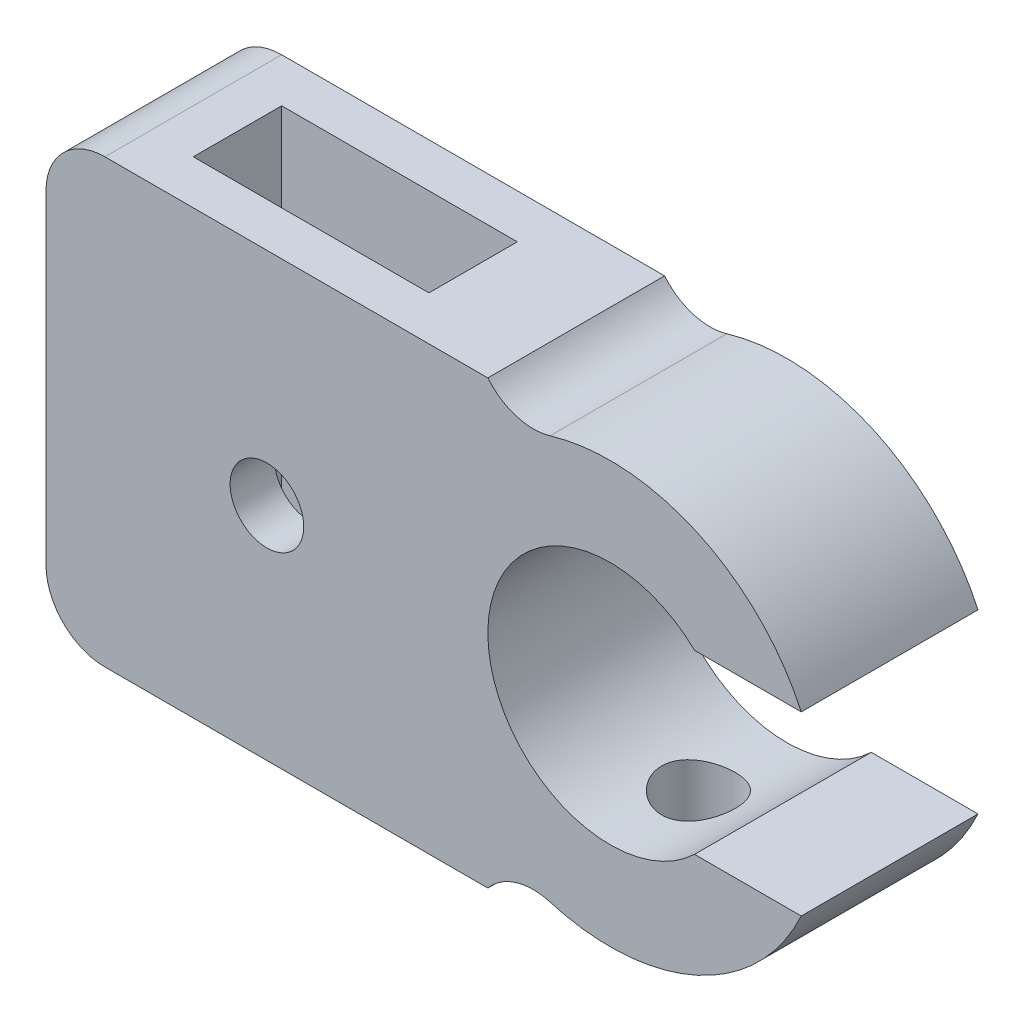
ISO-10303-21;
HEADER;
FILE_DESCRIPTION(('STEP AP214'),'2;1');
FILE_NAME('part.step','',(''),(''),'','','');
FILE_SCHEMA(('AUTOMOTIVE_DESIGN { 1 0 10303 214 1 1 1 1 }'));
ENDSEC;
DATA;
#1=APPLICATION_CONTEXT('core data for automotive mechanical design processes');
#2=APPLICATION_PROTOCOL_DEFINITION('international standard','automotive_design',2000,#1);
#3=PRODUCT_CONTEXT('',#1,'mechanical');
#4=PRODUCT('Part','Part','',(#3));
#5=PRODUCT_RELATED_PRODUCT_CATEGORY('part','',(#4));
#6=PRODUCT_DEFINITION_FORMATION('','',#4);
#7=PRODUCT_DEFINITION_CONTEXT('part definition',#1,'design');
#8=PRODUCT_DEFINITION('design','',#6,#7);
#9=PRODUCT_DEFINITION_SHAPE('','',#8);
#10=(LENGTH_UNIT() NAMED_UNIT(*) SI_UNIT(.MILLI.,.METRE.));
#11=(NAMED_UNIT(*) PLANE_ANGLE_UNIT() SI_UNIT($,.RADIAN.));
#12=(NAMED_UNIT(*) SI_UNIT($,.STERADIAN.) SOLID_ANGLE_UNIT());
#13=UNCERTAINTY_MEASURE_WITH_UNIT(LENGTH_MEASURE(1.E-05),#10,'distance_accuracy_value','');
#14=(GEOMETRIC_REPRESENTATION_CONTEXT(3) GLOBAL_UNCERTAINTY_ASSIGNED_CONTEXT((#13)) GLOBAL_UNIT_ASSIGNED_CONTEXT((#10,
#11,#12)) REPRESENTATION_CONTEXT('',''));
#15=CARTESIAN_POINT('',(0.,0.,0.));
#16=DIRECTION('',(0.,0.,1.));
#17=DIRECTION('',(1.,0.,0.));
#18=AXIS2_PLACEMENT_3D('',#15,#16,#17);
#19=CARTESIAN_POINT('',(0.,0.,3.));
#20=DIRECTION('',(0.,0.,-1.));
#21=DIRECTION('',(-1.,0.,0.));
#22=AXIS2_PLACEMENT_3D('',#19,#20,#21);
#23=PLANE('',#22);
#24=CARTESIAN_POINT('',(0.,0.,3.));
#25=DIRECTION('',(0.,0.,1.));
#26=DIRECTION('',(1.,0.,0.));
#27=AXIS2_PLACEMENT_3D('',#24,#25,#26);
#28=CIRCLE('',#27,1.24999999999999);
#29=CARTESIAN_POINT('',(1.24999999999999,0.,3.));
#30=VERTEX_POINT('',#29);
#31=EDGE_CURVE('E385',#30,#30,#28,.T.);
#32=ORIENTED_EDGE('',*,*,#31,.F.);
#33=EDGE_LOOP('',(#32));
#34=FACE_BOUND('',#33,.T.);
#35=DIRECTION('',(-1.,0.,0.));
#36=VECTOR('',#35,1.);
#37=CARTESIAN_POINT('',(18.8,3.,3.));
#38=LINE('',#37,#36);
#39=CARTESIAN_POINT('',(18.1401848972121,3.,3.));
#40=VERTEX_POINT('',#39);
#41=CARTESIAN_POINT('',(14.5174901917879,3.,3.));
#42=VERTEX_POINT('',#41);
#43=EDGE_CURVE('E152',#40,#42,#38,.T.);
#44=ORIENTED_EDGE('',*,*,#43,.F.);
#45=CARTESIAN_POINT('',(11.65,0.,3.));
#46=DIRECTION('',(0.,0.,1.));
#47=DIRECTION('',(1.,0.,0.));
#48=AXIS2_PLACEMENT_3D('',#45,#46,#47);
#49=CIRCLE('',#48,7.15);
#50=CARTESIAN_POINT('',(9.61371990340148,6.85390861977286,3.));
#51=VERTEX_POINT('',#50);
#52=EDGE_CURVE('E170',#40,#51,#49,.T.);
#53=ORIENTED_EDGE('',*,*,#52,.T.);
#54=CARTESIAN_POINT('',(9.0441310651921,8.77108585607296,3.));
#55=DIRECTION('',(0.,0.,-1.));
#56=DIRECTION('',(-1.,0.,0.));
#57=AXIS2_PLACEMENT_3D('',#54,#55,#56);
#58=CIRCLE('',#57,2.);
#59=CARTESIAN_POINT('',(7.5,7.5,3.));
#60=VERTEX_POINT('',#59);
#61=EDGE_CURVE('E266',#51,#60,#58,.T.);
#62=ORIENTED_EDGE('',*,*,#61,.T.);
#63=DIRECTION('',(-1.,0.,0.));
#64=VECTOR('',#63,1.);
#65=CARTESIAN_POINT('',(-7.5,7.5,3.));
#66=LINE('',#65,#64);
#67=CARTESIAN_POINT('',(-5.5,7.5,3.));
#68=VERTEX_POINT('',#67);
#69=EDGE_CURVE('E223',#60,#68,#66,.T.);
#70=ORIENTED_EDGE('',*,*,#69,.T.);
#71=CARTESIAN_POINT('',(-5.5,5.5,3.));
#72=DIRECTION('',(0.,0.,-1.));
#73=DIRECTION('',(-1.,0.,0.));
#74=AXIS2_PLACEMENT_3D('',#71,#72,#73);
#75=CIRCLE('',#74,2.);
#76=CARTESIAN_POINT('',(-7.5,5.5,3.));
#77=VERTEX_POINT('',#76);
#78=EDGE_CURVE('E256',#68,#77,#75,.F.);
#79=ORIENTED_EDGE('',*,*,#78,.T.);
#80=DIRECTION('',(0.,-1.,0.));
#81=VECTOR('',#80,1.);
#82=CARTESIAN_POINT('',(-7.5,-7.5,3.));
#83=LINE('',#82,#81);
#84=CARTESIAN_POINT('',(-7.5,-5.5,3.));
#85=VERTEX_POINT('',#84);
#86=EDGE_CURVE('E225',#77,#85,#83,.T.);
#87=ORIENTED_EDGE('',*,*,#86,.T.);
#88=CARTESIAN_POINT('',(-5.5,-5.5,3.));
#89=DIRECTION('',(0.,0.,-1.));
#90=DIRECTION('',(-1.,0.,0.));
#91=AXIS2_PLACEMENT_3D('',#88,#89,#90);
#92=CIRCLE('',#91,2.);
#93=CARTESIAN_POINT('',(-5.5,-7.5,3.));
#94=VERTEX_POINT('',#93);
#95=EDGE_CURVE('E258',#85,#94,#92,.F.);
#96=ORIENTED_EDGE('',*,*,#95,.T.);
#97=DIRECTION('',(1.,0.,0.));
#98=VECTOR('',#97,1.);
#99=CARTESIAN_POINT('',(-7.5,-7.5,3.));
#100=LINE('',#99,#98);
#101=CARTESIAN_POINT('',(7.5,-7.5,3.));
#102=VERTEX_POINT('',#101);
#103=EDGE_CURVE('E229',#94,#102,#100,.T.);
#104=ORIENTED_EDGE('',*,*,#103,.T.);
#105=CARTESIAN_POINT('',(9.04413106519209,-8.77108585607296,3.));
#106=DIRECTION('',(0.,0.,-1.));
#107=DIRECTION('',(-1.,0.,0.));
#108=AXIS2_PLACEMENT_3D('',#105,#106,#107);
#109=CIRCLE('',#108,2.);
#110=CARTESIAN_POINT('',(9.61371990340147,-6.85390861977286,3.));
#111=VERTEX_POINT('',#110);
#112=EDGE_CURVE('E271',#102,#111,#109,.T.);
#113=ORIENTED_EDGE('',*,*,#112,.T.);
#114=CARTESIAN_POINT('',(18.1401848972121,-3.,3.));
#115=VERTEX_POINT('',#114);
#116=EDGE_CURVE('E189',#111,#115,#49,.T.);
#117=ORIENTED_EDGE('',*,*,#116,.T.);
#118=DIRECTION('',(-1.,0.,0.));
#119=VECTOR('',#118,1.);
#120=CARTESIAN_POINT('',(18.8,-3.,3.));
#121=LINE('',#120,#119);
#122=CARTESIAN_POINT('',(14.5174901917879,-3.,3.));
#123=VERTEX_POINT('',#122);
#124=EDGE_CURVE('E53',#115,#123,#121,.T.);
#125=ORIENTED_EDGE('',*,*,#124,.T.);
#126=CARTESIAN_POINT('',(11.65,0.,3.));
#127=DIRECTION('',(0.,0.,-1.));
#128=DIRECTION('',(-1.,0.,0.));
#129=AXIS2_PLACEMENT_3D('',#126,#127,#128);
#130=CIRCLE('',#129,4.15);
#131=EDGE_CURVE('E160',#123,#42,#130,.T.);
#132=ORIENTED_EDGE('',*,*,#131,.T.);
#133=EDGE_LOOP('',(#44,#53,#62,#70,#79,#87,#96,#104,#113,#117,#125,#132));
#134=FACE_BOUND('',#133,.T.);
#135=ADVANCED_FACE('F33',(#34,#134),#23,.F.);
#136=CARTESIAN_POINT('',(0.,0.,-3.));
#137=DIRECTION('',(0.,0.,-1.));
#138=DIRECTION('',(-1.,0.,0.));
#139=AXIS2_PLACEMENT_3D('',#136,#137,#138);
#140=PLANE('',#139);
#141=CARTESIAN_POINT('',(0.,0.,-3.));
#142=DIRECTION('',(0.,0.,-1.));
#143=DIRECTION('',(-1.,0.,0.));
#144=AXIS2_PLACEMENT_3D('',#141,#142,#143);
#145=CIRCLE('',#144,1.24999999999999);
#146=CARTESIAN_POINT('',(-1.24999999999999,0.,-3.));
#147=VERTEX_POINT('',#146);
#148=EDGE_CURVE('E392',#147,#147,#145,.T.);
#149=ORIENTED_EDGE('',*,*,#148,.F.);
#150=EDGE_LOOP('',(#149));
#151=FACE_BOUND('',#150,.T.);
#152=CARTESIAN_POINT('',(11.65,0.,-3.));
#153=DIRECTION('',(0.,0.,1.));
#154=DIRECTION('',(1.,0.,0.));
#155=AXIS2_PLACEMENT_3D('',#152,#153,#154);
#156=CIRCLE('',#155,7.15);
#157=CARTESIAN_POINT('',(18.1401848972121,3.,-3.));
#158=VERTEX_POINT('',#157);
#159=CARTESIAN_POINT('',(9.61371990340148,6.85390861977286,-3.));
#160=VERTEX_POINT('',#159);
#161=EDGE_CURVE('E188',#158,#160,#156,.T.);
#162=ORIENTED_EDGE('',*,*,#161,.F.);
#163=DIRECTION('',(-1.,0.,0.));
#164=VECTOR('',#163,1.);
#165=CARTESIAN_POINT('',(18.8,3.,-3.));
#166=LINE('',#165,#164);
#167=CARTESIAN_POINT('',(14.5174901917879,3.,-3.));
#168=VERTEX_POINT('',#167);
#169=EDGE_CURVE('E178',#158,#168,#166,.T.);
#170=ORIENTED_EDGE('',*,*,#169,.T.);
#171=CARTESIAN_POINT('',(11.65,0.,-3.));
#172=DIRECTION('',(0.,0.,-1.));
#173=DIRECTION('',(-1.,0.,0.));
#174=AXIS2_PLACEMENT_3D('',#171,#172,#173);
#175=CIRCLE('',#174,4.15);
#176=CARTESIAN_POINT('',(14.5174901917879,-3.,-3.));
#177=VERTEX_POINT('',#176);
#178=EDGE_CURVE('E168',#177,#168,#175,.T.);
#179=ORIENTED_EDGE('',*,*,#178,.F.);
#180=DIRECTION('',(-1.,0.,0.));
#181=VECTOR('',#180,1.);
#182=CARTESIAN_POINT('',(18.8,-3.,-3.));
#183=LINE('',#182,#181);
#184=CARTESIAN_POINT('',(18.1401848972121,-3.,-3.));
#185=VERTEX_POINT('',#184);
#186=EDGE_CURVE('E161',#185,#177,#183,.T.);
#187=ORIENTED_EDGE('',*,*,#186,.F.);
#188=CARTESIAN_POINT('',(9.61371990340147,-6.85390861977286,-3.));
#189=VERTEX_POINT('',#188);
#190=EDGE_CURVE('E184',#189,#185,#156,.T.);
#191=ORIENTED_EDGE('',*,*,#190,.F.);
#192=CARTESIAN_POINT('',(9.04413106519209,-8.77108585607296,-3.));
#193=DIRECTION('',(0.,0.,-1.));
#194=DIRECTION('',(-1.,0.,0.));
#195=AXIS2_PLACEMENT_3D('',#192,#193,#194);
#196=CIRCLE('',#195,2.);
#197=CARTESIAN_POINT('',(7.5,-7.5,-3.));
#198=VERTEX_POINT('',#197);
#199=EDGE_CURVE('E273',#189,#198,#196,.F.);
#200=ORIENTED_EDGE('',*,*,#199,.T.);
#201=DIRECTION('',(1.,0.,0.));
#202=VECTOR('',#201,1.);
#203=CARTESIAN_POINT('',(-7.5,-7.5,-3.));
#204=LINE('',#203,#202);
#205=CARTESIAN_POINT('',(-5.5,-7.5,-3.));
#206=VERTEX_POINT('',#205);
#207=EDGE_CURVE('E226',#206,#198,#204,.T.);
#208=ORIENTED_EDGE('',*,*,#207,.F.);
#209=CARTESIAN_POINT('',(-5.5,-5.5,-3.));
#210=DIRECTION('',(0.,0.,-1.));
#211=DIRECTION('',(-1.,0.,0.));
#212=AXIS2_PLACEMENT_3D('',#209,#210,#211);
#213=CIRCLE('',#212,2.);
#214=CARTESIAN_POINT('',(-7.5,-5.5,-3.));
#215=VERTEX_POINT('',#214);
#216=EDGE_CURVE('E249',#206,#215,#213,.T.);
#217=ORIENTED_EDGE('',*,*,#216,.T.);
#218=DIRECTION('',(0.,-1.,0.));
#219=VECTOR('',#218,1.);
#220=CARTESIAN_POINT('',(-7.5,-7.5,-3.));
#221=LINE('',#220,#219);
#222=CARTESIAN_POINT('',(-7.5,5.5,-3.));
#223=VERTEX_POINT('',#222);
#224=EDGE_CURVE('E234',#223,#215,#221,.T.);
#225=ORIENTED_EDGE('',*,*,#224,.F.);
#226=CARTESIAN_POINT('',(-5.5,5.5,-3.));
#227=DIRECTION('',(0.,0.,-1.));
#228=DIRECTION('',(-1.,0.,0.));
#229=AXIS2_PLACEMENT_3D('',#226,#227,#228);
#230=CIRCLE('',#229,2.);
#231=CARTESIAN_POINT('',(-5.5,7.5,-3.));
#232=VERTEX_POINT('',#231);
#233=EDGE_CURVE('E247',#223,#232,#230,.T.);
#234=ORIENTED_EDGE('',*,*,#233,.T.);
#235=DIRECTION('',(-1.,0.,0.));
#236=VECTOR('',#235,1.);
#237=CARTESIAN_POINT('',(-7.5,7.5,-3.));
#238=LINE('',#237,#236);
#239=CARTESIAN_POINT('',(7.5,7.5,-3.));
#240=VERTEX_POINT('',#239);
#241=EDGE_CURVE('E216',#240,#232,#238,.T.);
#242=ORIENTED_EDGE('',*,*,#241,.F.);
#243=CARTESIAN_POINT('',(9.0441310651921,8.77108585607296,-3.));
#244=DIRECTION('',(0.,0.,-1.));
#245=DIRECTION('',(-1.,0.,0.));
#246=AXIS2_PLACEMENT_3D('',#243,#244,#245);
#247=CIRCLE('',#246,2.);
#248=EDGE_CURVE('E268',#240,#160,#247,.F.);
#249=ORIENTED_EDGE('',*,*,#248,.T.);
#250=EDGE_LOOP('',(#162,#170,#179,#187,#191,#200,#208,#217,#225,#234,#242,#249));
#251=FACE_BOUND('',#250,.T.);
#252=ADVANCED_FACE('F282',(#151,#251),#140,.T.);
#253=CARTESIAN_POINT('',(11.65,0.,-3.));
#254=DIRECTION('',(0.,0.,1.));
#255=DIRECTION('',(1.,0.,0.));
#256=AXIS2_PLACEMENT_3D('',#253,#254,#255);
#257=CYLINDRICAL_SURFACE('',#256,7.15);
#258=ORIENTED_EDGE('',*,*,#52,.F.);
#259=DIRECTION('',(0.,0.,1.));
#260=VECTOR('',#259,1.);
#261=CARTESIAN_POINT('',(18.1401848972121,3.,-3.));
#262=LINE('',#261,#260);
#263=EDGE_CURVE('E11',#40,#158,#262,.F.);
#264=ORIENTED_EDGE('',*,*,#263,.T.);
#265=ORIENTED_EDGE('',*,*,#161,.T.);
#266=DIRECTION('',(0.,0.,1.));
#267=VECTOR('',#266,1.);
#268=CARTESIAN_POINT('',(9.61371990340148,6.85390861977286,-3.));
#269=LINE('',#268,#267);
#270=EDGE_CURVE('E263',#160,#51,#269,.T.);
#271=ORIENTED_EDGE('',*,*,#270,.T.);
#272=EDGE_LOOP('',(#258,#264,#265,#271));
#273=FACE_BOUND('',#272,.T.);
#274=ADVANCED_FACE('F313',(#273),#257,.T.);
#275=CARTESIAN_POINT('',(-7.5,7.5,3.));
#276=DIRECTION('',(0.,-1.,0.));
#277=DIRECTION('',(0.,0.,-1.));
#278=AXIS2_PLACEMENT_3D('',#275,#276,#277);
#279=PLANE('',#278);
#280=DIRECTION('',(1.,0.,0.));
#281=VECTOR('',#280,1.);
#282=CARTESIAN_POINT('',(-4.,7.5,-1.5));
#283=LINE('',#282,#281);
#284=CARTESIAN_POINT('',(-4.,7.5,-1.5));
#285=VERTEX_POINT('',#284);
#286=CARTESIAN_POINT('',(4.,7.5,-1.5));
#287=VERTEX_POINT('',#286);
#288=EDGE_CURVE('E201',#285,#287,#283,.T.);
#289=ORIENTED_EDGE('',*,*,#288,.T.);
#290=DIRECTION('',(0.,0.,1.));
#291=VECTOR('',#290,1.);
#292=CARTESIAN_POINT('',(4.,7.5,-1.5));
#293=LINE('',#292,#291);
#294=CARTESIAN_POINT('',(4.,7.5,1.5));
#295=VERTEX_POINT('',#294);
#296=EDGE_CURVE('E191',#287,#295,#293,.T.);
#297=ORIENTED_EDGE('',*,*,#296,.T.);
#298=DIRECTION('',(-1.,0.,0.));
#299=VECTOR('',#298,1.);
#300=CARTESIAN_POINT('',(-4.,7.5,1.5));
#301=LINE('',#300,#299);
#302=CARTESIAN_POINT('',(-4.,7.5,1.5));
#303=VERTEX_POINT('',#302);
#304=EDGE_CURVE('E194',#295,#303,#301,.T.);
#305=ORIENTED_EDGE('',*,*,#304,.T.);
#306=DIRECTION('',(0.,0.,-1.));
#307=VECTOR('',#306,1.);
#308=CARTESIAN_POINT('',(-4.,7.5,-1.5));
#309=LINE('',#308,#307);
#310=EDGE_CURVE('E198',#303,#285,#309,.T.);
#311=ORIENTED_EDGE('',*,*,#310,.T.);
#312=EDGE_LOOP('',(#289,#297,#305,#311));
#313=FACE_BOUND('',#312,.T.);
#314=ORIENTED_EDGE('',*,*,#241,.T.);
#315=DIRECTION('',(0.,0.,-1.));
#316=VECTOR('',#315,1.);
#317=CARTESIAN_POINT('',(-5.5,7.5,3.));
#318=LINE('',#317,#316);
#319=EDGE_CURVE('E61',#232,#68,#318,.F.);
#320=ORIENTED_EDGE('',*,*,#319,.T.);
#321=ORIENTED_EDGE('',*,*,#69,.F.);
#322=DIRECTION('',(0.,0.,-1.));
#323=VECTOR('',#322,1.);
#324=CARTESIAN_POINT('',(7.5,7.5,3.));
#325=LINE('',#324,#323);
#326=EDGE_CURVE('E241',#60,#240,#325,.T.);
#327=ORIENTED_EDGE('',*,*,#326,.T.);
#328=EDGE_LOOP('',(#314,#320,#321,#327));
#329=FACE_BOUND('',#328,.T.);
#330=ADVANCED_FACE('F305',(#313,#329),#279,.F.);
#331=CARTESIAN_POINT('',(-7.5,-7.5,3.));
#332=DIRECTION('',(1.,0.,0.));
#333=DIRECTION('',(0.,0.,-1.));
#334=AXIS2_PLACEMENT_3D('',#331,#332,#333);
#335=PLANE('',#334);
#336=ORIENTED_EDGE('',*,*,#224,.T.);
#337=DIRECTION('',(0.,0.,-1.));
#338=VECTOR('',#337,1.);
#339=CARTESIAN_POINT('',(-7.5,-5.5,3.));
#340=LINE('',#339,#338);
#341=EDGE_CURVE('E254',#215,#85,#340,.F.);
#342=ORIENTED_EDGE('',*,*,#341,.T.);
#343=ORIENTED_EDGE('',*,*,#86,.F.);
#344=DIRECTION('',(0.,0.,-1.));
#345=VECTOR('',#344,1.);
#346=CARTESIAN_POINT('',(-7.5,5.5,3.));
#347=LINE('',#346,#345);
#348=EDGE_CURVE('E251',#77,#223,#347,.T.);
#349=ORIENTED_EDGE('',*,*,#348,.T.);
#350=EDGE_LOOP('',(#336,#342,#343,#349));
#351=FACE_BOUND('',#350,.T.);
#352=ADVANCED_FACE('F299',(#351),#335,.F.);
#353=CARTESIAN_POINT('',(-7.5,-7.5,3.));
#354=DIRECTION('',(0.,1.,0.));
#355=DIRECTION('',(0.,0.,1.));
#356=AXIS2_PLACEMENT_3D('',#353,#354,#355);
#357=PLANE('',#356);
#358=DIRECTION('',(-1.,0.,0.));
#359=VECTOR('',#358,1.);
#360=CARTESIAN_POINT('',(-4.,-7.5,1.5));
#361=LINE('',#360,#359);
#362=CARTESIAN_POINT('',(4.,-7.5,1.5));
#363=VERTEX_POINT('',#362);
#364=CARTESIAN_POINT('',(-4.,-7.5,1.5));
#365=VERTEX_POINT('',#364);
#366=EDGE_CURVE('E206',#363,#365,#361,.T.);
#367=ORIENTED_EDGE('',*,*,#366,.F.);
#368=DIRECTION('',(0.,0.,1.));
#369=VECTOR('',#368,1.);
#370=CARTESIAN_POINT('',(4.,-7.5,-1.5));
#371=LINE('',#370,#369);
#372=CARTESIAN_POINT('',(4.,-7.5,-1.5));
#373=VERTEX_POINT('',#372);
#374=EDGE_CURVE('E187',#373,#363,#371,.T.);
#375=ORIENTED_EDGE('',*,*,#374,.F.);
#376=DIRECTION('',(1.,0.,0.));
#377=VECTOR('',#376,1.);
#378=CARTESIAN_POINT('',(-4.,-7.5,-1.5));
#379=LINE('',#378,#377);
#380=CARTESIAN_POINT('',(-4.,-7.5,-1.5));
#381=VERTEX_POINT('',#380);
#382=EDGE_CURVE('E195',#381,#373,#379,.T.);
#383=ORIENTED_EDGE('',*,*,#382,.F.);
#384=DIRECTION('',(0.,0.,-1.));
#385=VECTOR('',#384,1.);
#386=CARTESIAN_POINT('',(-4.,-7.5,-1.5));
#387=LINE('',#386,#385);
#388=EDGE_CURVE('E209',#365,#381,#387,.T.);
#389=ORIENTED_EDGE('',*,*,#388,.F.);
#390=EDGE_LOOP('',(#367,#375,#383,#389));
#391=FACE_BOUND('',#390,.T.);
#392=ORIENTED_EDGE('',*,*,#103,.F.);
#393=DIRECTION('',(0.,0.,-1.));
#394=VECTOR('',#393,1.);
#395=CARTESIAN_POINT('',(-5.5,-7.5,3.));
#396=LINE('',#395,#394);
#397=EDGE_CURVE('E244',#94,#206,#396,.T.);
#398=ORIENTED_EDGE('',*,*,#397,.T.);
#399=ORIENTED_EDGE('',*,*,#207,.T.);
#400=DIRECTION('',(0.,0.,-1.));
#401=VECTOR('',#400,1.);
#402=CARTESIAN_POINT('',(7.5,-7.5,3.));
#403=LINE('',#402,#401);
#404=EDGE_CURVE('E232',#102,#198,#403,.T.);
#405=ORIENTED_EDGE('',*,*,#404,.F.);
#406=EDGE_LOOP('',(#392,#398,#399,#405));
#407=FACE_BOUND('',#406,.T.);
#408=ADVANCED_FACE('F291',(#391,#407),#357,.F.);
#409=CARTESIAN_POINT('',(4.,7.5,-1.5));
#410=DIRECTION('',(1.,0.,0.));
#411=DIRECTION('',(0.,0.,-1.));
#412=AXIS2_PLACEMENT_3D('',#409,#410,#411);
#413=PLANE('',#412);
#414=ORIENTED_EDGE('',*,*,#374,.T.);
#415=DIRECTION('',(0.,-1.,0.));
#416=VECTOR('',#415,1.);
#417=CARTESIAN_POINT('',(4.,7.5,1.5));
#418=LINE('',#417,#416);
#419=EDGE_CURVE('E204',#295,#363,#418,.T.);
#420=ORIENTED_EDGE('',*,*,#419,.F.);
#421=ORIENTED_EDGE('',*,*,#296,.F.);
#422=DIRECTION('',(0.,-1.,0.));
#423=VECTOR('',#422,1.);
#424=CARTESIAN_POINT('',(4.,7.5,-1.5));
#425=LINE('',#424,#423);
#426=EDGE_CURVE('E214',#287,#373,#425,.T.);
#427=ORIENTED_EDGE('',*,*,#426,.T.);
#428=EDGE_LOOP('',(#414,#420,#421,#427));
#429=FACE_BOUND('',#428,.T.);
#430=ADVANCED_FACE('F338',(#429),#413,.F.);
#431=CARTESIAN_POINT('',(-4.,7.5,-1.5));
#432=DIRECTION('',(0.,0.,-1.));
#433=DIRECTION('',(-1.,0.,0.));
#434=AXIS2_PLACEMENT_3D('',#431,#432,#433);
#435=PLANE('',#434);
#436=CARTESIAN_POINT('',(0.,0.,-1.5));
#437=DIRECTION('',(0.,0.,-1.));
#438=DIRECTION('',(-1.,0.,0.));
#439=AXIS2_PLACEMENT_3D('',#436,#437,#438);
#440=CIRCLE('',#439,1.24999999999999);
#441=CARTESIAN_POINT('',(-1.24999999999999,0.,-1.5));
#442=VERTEX_POINT('',#441);
#443=EDGE_CURVE('E389',#442,#442,#440,.T.);
#444=ORIENTED_EDGE('',*,*,#443,.T.);
#445=EDGE_LOOP('',(#444));
#446=FACE_BOUND('',#445,.T.);
#447=ORIENTED_EDGE('',*,*,#382,.T.);
#448=ORIENTED_EDGE('',*,*,#426,.F.);
#449=ORIENTED_EDGE('',*,*,#288,.F.);
#450=DIRECTION('',(0.,-1.,0.));
#451=VECTOR('',#450,1.);
#452=CARTESIAN_POINT('',(-4.,7.5,-1.5));
#453=LINE('',#452,#451);
#454=EDGE_CURVE('E217',#285,#381,#453,.T.);
#455=ORIENTED_EDGE('',*,*,#454,.T.);
#456=EDGE_LOOP('',(#447,#448,#449,#455));
#457=FACE_BOUND('',#456,.T.);
#458=ADVANCED_FACE('F400',(#446,#457),#435,.F.);
#459=CARTESIAN_POINT('',(-4.,7.5,-1.5));
#460=DIRECTION('',(-1.,0.,0.));
#461=DIRECTION('',(0.,0.,1.));
#462=AXIS2_PLACEMENT_3D('',#459,#460,#461);
#463=PLANE('',#462);
#464=ORIENTED_EDGE('',*,*,#388,.T.);
#465=ORIENTED_EDGE('',*,*,#454,.F.);
#466=ORIENTED_EDGE('',*,*,#310,.F.);
#467=DIRECTION('',(0.,-1.,0.));
#468=VECTOR('',#467,1.);
#469=CARTESIAN_POINT('',(-4.,7.5,1.5));
#470=LINE('',#469,#468);
#471=EDGE_CURVE('E219',#303,#365,#470,.T.);
#472=ORIENTED_EDGE('',*,*,#471,.T.);
#473=EDGE_LOOP('',(#464,#465,#466,#472));
#474=FACE_BOUND('',#473,.T.);
#475=ADVANCED_FACE('F403',(#474),#463,.F.);
#476=CARTESIAN_POINT('',(-4.,7.5,1.5));
#477=DIRECTION('',(0.,0.,1.));
#478=DIRECTION('',(1.,0.,0.));
#479=AXIS2_PLACEMENT_3D('',#476,#477,#478);
#480=PLANE('',#479);
#481=CARTESIAN_POINT('',(0.,0.,1.5));
#482=DIRECTION('',(0.,0.,1.));
#483=DIRECTION('',(1.,0.,0.));
#484=AXIS2_PLACEMENT_3D('',#481,#482,#483);
#485=CIRCLE('',#484,1.24999999999999);
#486=CARTESIAN_POINT('',(1.24999999999999,0.,1.5));
#487=VERTEX_POINT('',#486);
#488=EDGE_CURVE('E367',#487,#487,#485,.T.);
#489=ORIENTED_EDGE('',*,*,#488,.T.);
#490=EDGE_LOOP('',(#489));
#491=FACE_BOUND('',#490,.T.);
#492=ORIENTED_EDGE('',*,*,#366,.T.);
#493=ORIENTED_EDGE('',*,*,#471,.F.);
#494=ORIENTED_EDGE('',*,*,#304,.F.);
#495=ORIENTED_EDGE('',*,*,#419,.T.);
#496=EDGE_LOOP('',(#492,#493,#494,#495));
#497=FACE_BOUND('',#496,.T.);
#498=ADVANCED_FACE('F328',(#491,#497),#480,.F.);
#499=CARTESIAN_POINT('',(11.65,-7.15,-1.25));
#500=CARTESIAN_POINT('',(11.7196441387812,-7.14999877594835,-1.24999725435242));
#501=CARTESIAN_POINT('',(11.7893250115171,-7.14897188912919,-1.24415996759985));
#502=CARTESIAN_POINT('',(11.9267289300519,-7.14497435181836,-1.22097676889528));
#503=CARTESIAN_POINT('',(11.9944501752748,-7.1420019694707,-1.2036206027872));
#504=CARTESIAN_POINT('',(12.1259273072636,-7.13444649598437,-1.15794260654072));
#505=CARTESIAN_POINT('',(12.1896865127389,-7.12986477487177,-1.12963010142765));
#506=CARTESIAN_POINT('',(12.3115422886364,-7.11959308729978,-1.06286832879707));
#507=CARTESIAN_POINT('',(12.3696394337599,-7.11390323349244,-1.02442009153101));
#508=CARTESIAN_POINT('',(12.4791378288451,-7.10197835515108,-0.938050139787145));
#509=CARTESIAN_POINT('',(12.5304711637884,-7.09573871776607,-0.890042951570322));
#510=CARTESIAN_POINT('',(12.6243977805085,-7.08345241584801,-0.786101791444626));
#511=CARTESIAN_POINT('',(12.6669904827956,-7.07740576413204,-0.730167294383513));
#512=CARTESIAN_POINT('',(12.7425028887629,-7.06614534072088,-0.611487629138943));
#513=CARTESIAN_POINT('',(12.7753546992919,-7.06093752535314,-0.548698647911705));
#514=CARTESIAN_POINT('',(12.8300184439748,-7.05200882460279,-0.41838701036703));
#515=CARTESIAN_POINT('',(12.851831201088,-7.04828782838247,-0.350864707345177));
#516=CARTESIAN_POINT('',(12.8835821482794,-7.04280019883798,-0.213725701129803));
#517=CARTESIAN_POINT('',(12.8936380525582,-7.04101420500956,-0.144137041201296));
#518=CARTESIAN_POINT('',(12.9019549724211,-7.03954031063182,-0.00423901411399889));
#519=CARTESIAN_POINT('',(12.900216906535,-7.03985224669297,0.0660702964937369));
#520=CARTESIAN_POINT('',(12.8850909416025,-7.04252130893856,0.204568795993028));
#521=CARTESIAN_POINT('',(12.8718358853177,-7.04485511298783,0.272773008397113));
#522=CARTESIAN_POINT('',(12.8342609543625,-7.05126839690547,0.405974365905905));
#523=CARTESIAN_POINT('',(12.809940665659,-7.05534794209473,0.470971390904868));
#524=CARTESIAN_POINT('',(12.7507927623914,-7.06481793312345,0.596307627524831));
#525=CARTESIAN_POINT('',(12.7159105624402,-7.07021516015972,0.656620546083239));
#526=CARTESIAN_POINT('',(12.6366677109939,-7.08170776337077,0.770587368547652));
#527=CARTESIAN_POINT('',(12.5923062197182,-7.08780320137862,0.824240681805779));
#528=CARTESIAN_POINT('',(12.4946431088624,-7.10010758173281,0.924133700651464));
#529=CARTESIAN_POINT('',(12.441227642827,-7.10631693715304,0.970262122631985));
#530=CARTESIAN_POINT('',(12.3273563351006,-7.11807271939641,1.05291881336347));
#531=CARTESIAN_POINT('',(12.2669004392029,-7.12361914111474,1.08944700819209));
#532=CARTESIAN_POINT('',(12.1405554359103,-7.13343320075707,1.15187882449272));
#533=CARTESIAN_POINT('',(12.0746610412814,-7.13769957511105,1.17777195704104));
#534=CARTESIAN_POINT('',(11.9393672826077,-7.14446285059705,1.21809188568484));
#535=CARTESIAN_POINT('',(11.8699682422094,-7.14695991480212,1.23251973852241));
#536=CARTESIAN_POINT('',(11.730593670212,-7.14988111263945,1.24934717133578));
#537=CARTESIAN_POINT('',(11.6606371022984,-7.15033155308254,1.25189940797974));
#538=CARTESIAN_POINT('',(11.5212963196976,-7.14918103592511,1.24531109239644));
#539=CARTESIAN_POINT('',(11.4519120808223,-7.14758016546978,1.23617103688911));
#540=CARTESIAN_POINT('',(11.3161618451072,-7.14252322163073,1.20658455061221));
#541=CARTESIAN_POINT('',(11.2497787323465,-7.13907965748065,1.18621432859577));
#542=CARTESIAN_POINT('',(11.1213697926094,-7.13072184564712,1.13482744987415));
#543=CARTESIAN_POINT('',(11.059344230566,-7.1258075086381,1.10381014651483));
#544=CARTESIAN_POINT('',(10.9407523452637,-7.11498781676556,1.03166439857575));
#545=CARTESIAN_POINT('',(10.8842444023353,-7.10907336662401,0.990441380375853));
#546=CARTESIAN_POINT('',(10.7788935964101,-7.09693531954218,0.899183658876034));
#547=CARTESIAN_POINT('',(10.730051350379,-7.09071169777156,0.849148247006651));
#548=CARTESIAN_POINT('',(10.6408471205732,-7.07857084139086,0.740998888702286));
#549=CARTESIAN_POINT('',(10.6005886820158,-7.07265793285131,0.682798971850008));
#550=CARTESIAN_POINT('',(10.5304198392788,-7.06189108612388,0.560372764211681));
#551=CARTESIAN_POINT('',(10.5005090841383,-7.05703711202232,0.496146677908365));
#552=CARTESIAN_POINT('',(10.4520365057012,-7.04897074870289,0.36377069902559));
#553=CARTESIAN_POINT('',(10.4334246896866,-7.04575113868659,0.295639572599729));
#554=CARTESIAN_POINT('',(10.4079220962668,-7.04130051827424,0.157156599271321));
#555=CARTESIAN_POINT('',(10.4010301867555,-7.04006931580487,0.0868049675313598));
#556=CARTESIAN_POINT('',(10.3991970211041,-7.03974375137557,-0.0530868666897399));
#557=CARTESIAN_POINT('',(10.4040926599669,-7.04062022516329,-0.122624917201404));
#558=CARTESIAN_POINT('',(10.4253412694181,-7.04434705563507,-0.259871214450389));
#559=CARTESIAN_POINT('',(10.4416941917232,-7.0471974040008,-0.327579468897605));
#560=CARTESIAN_POINT('',(10.4853282462348,-7.05453927991021,-0.459171760999319));
#561=CARTESIAN_POINT('',(10.5125939602612,-7.05902849119699,-0.523061048538317));
#562=CARTESIAN_POINT('',(10.5772624946104,-7.06914426806549,-0.645384718291085));
#563=CARTESIAN_POINT('',(10.6146658996215,-7.0747708992428,-0.7038187856152));
#564=CARTESIAN_POINT('',(10.699124512829,-7.0866192743193,-0.814394732449283));
#565=CARTESIAN_POINT('',(10.7462992424544,-7.09284782286649,-0.866444605742962));
#566=CARTESIAN_POINT('',(10.8487102708852,-7.10514525495575,-0.961944696480905));
#567=CARTESIAN_POINT('',(10.9039484230589,-7.11121410141094,-1.00539293142442));
#568=CARTESIAN_POINT('',(11.0214242488258,-7.12256262380972,-1.08276415423069));
#569=CARTESIAN_POINT('',(11.0837124159442,-7.1278358816458,-1.11661143333659));
#570=CARTESIAN_POINT('',(11.2131596208731,-7.13693661298977,-1.17330871901586));
#571=CARTESIAN_POINT('',(11.2803138373039,-7.14076549488193,-1.19616944436663));
#572=CARTESIAN_POINT('',(11.3980882667149,-7.14573112960549,-1.22540295011839));
#573=CARTESIAN_POINT('',(11.4480045827266,-7.14732321841684,-1.2346117023265));
#574=CARTESIAN_POINT('',(11.548607452057,-7.149458088669,-1.24691116530276));
#575=CARTESIAN_POINT('',(11.5992939898747,-7.15000089119884,-1.2500019990316));
#576=CARTESIAN_POINT('',(11.65,-7.15,-1.25));
#577=B_SPLINE_CURVE_WITH_KNOTS('',3,(#499,#500,#501,#502,#503,#504,#505,#506,#507,#508,#509,
#510,#511,#512,#513,#514,#515,#516,#517,#518,#519,#520,#521,#522,#523,#524,#525,#526,#527,#528,
#529,#530,#531,#532,#533,#534,#535,#536,#537,#538,#539,#540,#541,#542,#543,#544,#545,#546,#547,
#548,#549,#550,#551,#552,#553,#554,#555,#556,#557,#558,#559,#560,#561,#562,#563,#564,#565,#566,
#567,#568,#569,#570,#571,#572,#573,#574,#575,#576),.UNSPECIFIED.,.T.,.F.,(4,2,2,2,2,2,2,2,2,2,2,
2,2,2,2,2,2,2,2,2,2,2,2,2,2,2,2,2,2,2,2,2,2,2,2,2,2,2,4),(0.,0.208747037823127,
0.417680152862123,0.626435833022043,0.83517030228485,1.04586259039598,1.25656884255128,
1.46871092384694,1.68083718766292,1.8908208613214,2.10078818136554,2.30836530860387,
2.51595020349349,2.72462678711421,2.93332186529109,3.14486777121391,3.35641530600568,
3.5681709832973,3.77990714103914,3.9889138480669,4.1979116762243,4.40550838246225,
4.61311769938882,4.82272803501955,5.03235523228303,5.24438359725781,5.45640477018944,
5.66748087480593,5.87853658897749,6.08668873454532,6.29484000292149,6.50269821628467,
6.7105684203616,6.92114978019577,7.13177961834355,7.34402693200872,7.55606674897845,
7.70805286499375,7.86003592629242),.UNSPECIFIED.);
#578=CARTESIAN_POINT('',(11.65,-7.15,-1.25));
#579=VERTEX_POINT('',#578);
#580=EDGE_CURVE('E37',#579,#579,#577,.T.);
#581=ORIENTED_EDGE('',*,*,#580,.F.);
#582=EDGE_LOOP('',(#581));
#583=FACE_BOUND('',#582,.T.);
#584=DIRECTION('',(0.,0.,1.));
#585=VECTOR('',#584,1.);
#586=CARTESIAN_POINT('',(18.1401848972121,-3.,-3.));
#587=LINE('',#586,#585);
#588=EDGE_CURVE('E46',#115,#185,#587,.F.);
#589=ORIENTED_EDGE('',*,*,#588,.F.);
#590=ORIENTED_EDGE('',*,*,#116,.F.);
#591=DIRECTION('',(0.,0.,1.));
#592=VECTOR('',#591,1.);
#593=CARTESIAN_POINT('',(9.61371990340147,-6.85390861977286,-3.));
#594=LINE('',#593,#592);
#595=EDGE_CURVE('E261',#111,#189,#594,.F.);
#596=ORIENTED_EDGE('',*,*,#595,.T.);
#597=ORIENTED_EDGE('',*,*,#190,.T.);
#598=EDGE_LOOP('',(#589,#590,#596,#597));
#599=FACE_BOUND('',#598,.T.);
#600=ADVANCED_FACE('F284',(#583,#599),#257,.T.);
#601=CARTESIAN_POINT('',(-5.5,-5.5,3.));
#602=DIRECTION('',(0.,0.,-1.));
#603=DIRECTION('',(-1.,0.,0.));
#604=AXIS2_PLACEMENT_3D('',#601,#602,#603);
#605=CYLINDRICAL_SURFACE('',#604,2.);
#606=ORIENTED_EDGE('',*,*,#95,.F.);
#607=ORIENTED_EDGE('',*,*,#341,.F.);
#608=ORIENTED_EDGE('',*,*,#216,.F.);
#609=ORIENTED_EDGE('',*,*,#397,.F.);
#610=EDGE_LOOP('',(#606,#607,#608,#609));
#611=FACE_BOUND('',#610,.T.);
#612=ADVANCED_FACE('F295',(#611),#605,.T.);
#613=CARTESIAN_POINT('',(-5.5,5.5,3.));
#614=DIRECTION('',(0.,0.,-1.));
#615=DIRECTION('',(-1.,0.,0.));
#616=AXIS2_PLACEMENT_3D('',#613,#614,#615);
#617=CYLINDRICAL_SURFACE('',#616,2.);
#618=ORIENTED_EDGE('',*,*,#78,.F.);
#619=ORIENTED_EDGE('',*,*,#319,.F.);
#620=ORIENTED_EDGE('',*,*,#233,.F.);
#621=ORIENTED_EDGE('',*,*,#348,.F.);
#622=EDGE_LOOP('',(#618,#619,#620,#621));
#623=FACE_BOUND('',#622,.T.);
#624=ADVANCED_FACE('F304',(#623),#617,.T.);
#625=CARTESIAN_POINT('',(9.0441310651921,8.77108585607296,3.));
#626=DIRECTION('',(0.,0.,-1.));
#627=DIRECTION('',(-1.,0.,0.));
#628=AXIS2_PLACEMENT_3D('',#625,#626,#627);
#629=CYLINDRICAL_SURFACE('',#628,2.);
#630=ORIENTED_EDGE('',*,*,#248,.F.);
#631=ORIENTED_EDGE('',*,*,#326,.F.);
#632=ORIENTED_EDGE('',*,*,#61,.F.);
#633=ORIENTED_EDGE('',*,*,#270,.F.);
#634=EDGE_LOOP('',(#630,#631,#632,#633));
#635=FACE_BOUND('',#634,.T.);
#636=ADVANCED_FACE('F311',(#635),#629,.F.);
#637=CARTESIAN_POINT('',(9.04413106519209,-8.77108585607296,-3.));
#638=DIRECTION('',(0.,0.,-1.));
#639=DIRECTION('',(-1.,0.,0.));
#640=AXIS2_PLACEMENT_3D('',#637,#638,#639);
#641=CYLINDRICAL_SURFACE('',#640,2.);
#642=ORIENTED_EDGE('',*,*,#199,.F.);
#643=ORIENTED_EDGE('',*,*,#595,.F.);
#644=ORIENTED_EDGE('',*,*,#112,.F.);
#645=ORIENTED_EDGE('',*,*,#404,.T.);
#646=EDGE_LOOP('',(#642,#643,#644,#645));
#647=FACE_BOUND('',#646,.T.);
#648=ADVANCED_FACE('F35',(#647),#641,.F.);
#649=CARTESIAN_POINT('',(18.8,3.,3.));
#650=DIRECTION('',(0.,-1.,0.));
#651=DIRECTION('',(1.,0.,0.));
#652=AXIS2_PLACEMENT_3D('',#649,#650,#651);
#653=PLANE('',#652);
#654=ORIENTED_EDGE('',*,*,#43,.T.);
#655=DIRECTION('',(0.,0.,-1.));
#656=VECTOR('',#655,1.);
#657=CARTESIAN_POINT('',(14.5174901917879,3.,3.));
#658=LINE('',#657,#656);
#659=EDGE_CURVE('E155',#42,#168,#658,.T.);
#660=ORIENTED_EDGE('',*,*,#659,.T.);
#661=ORIENTED_EDGE('',*,*,#169,.F.);
#662=ORIENTED_EDGE('',*,*,#263,.F.);
#663=EDGE_LOOP('',(#654,#660,#661,#662));
#664=FACE_BOUND('',#663,.T.);
#665=ADVANCED_FACE('F154',(#664),#653,.T.);
#666=CARTESIAN_POINT('',(11.65,0.,3.));
#667=DIRECTION('',(0.,0.,-1.));
#668=DIRECTION('',(-1.,0.,0.));
#669=AXIS2_PLACEMENT_3D('',#666,#667,#668);
#670=CYLINDRICAL_SURFACE('',#669,4.15);
#671=CARTESIAN_POINT('',(11.65,-4.15,-1.25));
#672=CARTESIAN_POINT('',(11.7185610742482,-4.14999943225383,-1.24999920365519));
#673=CARTESIAN_POINT('',(11.7871302072364,-4.14828475855764,-1.24434056534941));
#674=CARTESIAN_POINT('',(11.9222708784262,-4.14161215001059,-1.22190977731159));
#675=CARTESIAN_POINT('',(11.9888418286238,-4.13665327008788,-1.20513438913342));
#676=CARTESIAN_POINT('',(12.1180174437556,-4.124035448976,-1.16108160310697));
#677=CARTESIAN_POINT('',(12.1806278283709,-4.11638051142349,-1.13381977208942));
#678=CARTESIAN_POINT('',(12.3003887570706,-4.09916571671065,-1.06963202577959));
#679=CARTESIAN_POINT('',(12.3575385603984,-4.08960560164419,-1.03270480185939));
#680=CARTESIAN_POINT('',(12.4664087319587,-4.06929057647929,-0.949109457186391));
#681=CARTESIAN_POINT('',(12.5179489181331,-4.05851103253208,-0.902212679127608));
#682=CARTESIAN_POINT('',(12.6125648310175,-4.03711861661294,-0.800496754262972));
#683=CARTESIAN_POINT('',(12.6556391194461,-4.02650577324328,-0.745676264028933));
#684=CARTESIAN_POINT('',(12.7330514255416,-4.00638740632313,-0.628141124743177));
#685=CARTESIAN_POINT('',(12.76716902581,-3.99691247399573,-0.565275573100594));
#686=CARTESIAN_POINT('',(12.824274407228,-3.98051110747698,-0.434367860686723));
#687=CARTESIAN_POINT('',(12.8472648853896,-3.97358405582347,-0.366326958957522));
#688=CARTESIAN_POINT('',(12.8808127699882,-3.96331955802335,-0.229024204432957));
#689=CARTESIAN_POINT('',(12.8917025513896,-3.95988638066061,-0.159850911877417));
#690=CARTESIAN_POINT('',(12.901777846999,-3.95671361565205,-0.0205805268405623));
#691=CARTESIAN_POINT('',(12.900966222787,-3.9569731249591,0.0495163355924601));
#692=CARTESIAN_POINT('',(12.8879227083783,-3.9610716000522,0.185936760274248));
#693=CARTESIAN_POINT('',(12.8761078073309,-3.96477986204434,0.252304770053599));
#694=CARTESIAN_POINT('',(12.8420670640622,-3.97514647900548,0.382069166695216));
#695=CARTESIAN_POINT('',(12.8198401869142,-3.98180512723257,0.445465257466286));
#696=CARTESIAN_POINT('',(12.7653004912001,-3.99742617089137,0.568503657606473));
#697=CARTESIAN_POINT('',(12.7328528419916,-4.00641906255374,0.628082162778888));
#698=CARTESIAN_POINT('',(12.6588863788542,-4.02568072710457,0.7410880359574));
#699=CARTESIAN_POINT('',(12.6173653513616,-4.03594981107192,0.794513898084385));
#700=CARTESIAN_POINT('',(12.5243621562335,-4.05713632772959,0.896062262757456));
#701=CARTESIAN_POINT('',(12.4725341173609,-4.06806285154148,0.943866650418951));
#702=CARTESIAN_POINT('',(12.3614609348777,-4.08895003182931,1.03017974714126));
#703=CARTESIAN_POINT('',(12.3022153172578,-4.09891062650673,1.06868786167666));
#704=CARTESIAN_POINT('',(12.1774072678511,-4.11683588036875,1.13551057794109));
#705=CARTESIAN_POINT('',(12.1118046319663,-4.12478651076025,1.16375410401576));
#706=CARTESIAN_POINT('',(11.9764852617007,-4.13769489914003,1.2087127651856));
#707=CARTESIAN_POINT('',(11.9067696904305,-4.14265349884303,1.22543114271139));
#708=CARTESIAN_POINT('',(11.7679073965051,-4.14888577576233,1.24633415672021));
#709=CARTESIAN_POINT('',(11.6988311552585,-4.15028613783264,1.25094988649787));
#710=CARTESIAN_POINT('',(11.5608863314595,-4.14961610976252,1.24872555633214));
#711=CARTESIAN_POINT('',(11.4920177221923,-4.14754618704451,1.24188703919362));
#712=CARTESIAN_POINT('',(11.3580735725199,-4.14025112680448,1.21729667184018));
#713=CARTESIAN_POINT('',(11.2929473532281,-4.13509899213645,1.19979715885302));
#714=CARTESIAN_POINT('',(11.1665699549368,-4.12223646466815,1.15468555399933));
#715=CARTESIAN_POINT('',(11.1053192441131,-4.11452576348337,1.12707224307316));
#716=CARTESIAN_POINT('',(10.9868488238027,-4.09712109133591,1.06179606413299));
#717=CARTESIAN_POINT('',(10.9297559945365,-4.08738516575292,1.02391440743874));
#718=CARTESIAN_POINT('',(10.8225909328566,-4.06704736936419,0.939442403738722));
#719=CARTESIAN_POINT('',(10.7725204797089,-4.0564452801707,0.892849856597922));
#720=CARTESIAN_POINT('',(10.6789204143354,-4.03508315854529,0.790253044673005));
#721=CARTESIAN_POINT('',(10.6356975624637,-4.02433156528945,0.733966552196099));
#722=CARTESIAN_POINT('',(10.5592886283897,-4.00429950507924,0.614705707232447));
#723=CARTESIAN_POINT('',(10.5261022917732,-3.9950190008373,0.551731524325603));
#724=CARTESIAN_POINT('',(10.470933674669,-3.97908638023461,0.421077185308515));
#725=CARTESIAN_POINT('',(10.4488999478906,-3.97242222737215,0.353420305205174));
#726=CARTESIAN_POINT('',(10.4166054037828,-3.96251544303577,0.215118004816956));
#727=CARTESIAN_POINT('',(10.4063405105395,-3.95927162702392,0.144473627989645));
#728=CARTESIAN_POINT('',(10.3981536125374,-3.95669013260707,0.00539034362364741));
#729=CARTESIAN_POINT('',(10.399731245312,-3.95719409685831,-0.0630165547199112));
#730=CARTESIAN_POINT('',(10.4139889661263,-3.96167026855912,-0.198541876679145));
#731=CARTESIAN_POINT('',(10.4266686028669,-3.96564233502955,-0.265660352556148));
#732=CARTESIAN_POINT('',(10.4624462452078,-3.9765005095841,-0.395878357855282));
#733=CARTESIAN_POINT('',(10.4854107520564,-3.98334920998849,-0.45901791669436));
#734=CARTESIAN_POINT('',(10.541002218956,-3.99918184372818,-0.580598369459288));
#735=CARTESIAN_POINT('',(10.5736310398354,-4.00816618820815,-0.639038355741614));
#736=CARTESIAN_POINT('',(10.6490264715111,-4.02766916604576,-0.751880100762937));
#737=CARTESIAN_POINT('',(10.6921210824373,-4.03823199452785,-0.806055061885398));
#738=CARTESIAN_POINT('',(10.7866356712344,-4.0594882424126,-0.906566623858862));
#739=CARTESIAN_POINT('',(10.8380578152987,-4.0701816951228,-0.952901178799931));
#740=CARTESIAN_POINT('',(10.9495979173853,-4.09087321589732,-1.03778184643415));
#741=CARTESIAN_POINT('',(11.0099279490613,-4.10084139444101,-1.07605732460524));
#742=CARTESIAN_POINT('',(11.1364671030035,-4.11859871033667,-1.14186864991545));
#743=CARTESIAN_POINT('',(11.2026734991082,-4.12638885123406,-1.16940944544434));
#744=CARTESIAN_POINT('',(11.3319028548576,-4.13824529433583,-1.21054488715476));
#745=CARTESIAN_POINT('',(11.3945301773746,-4.14261670793141,-1.22530022076039));
#746=CARTESIAN_POINT('',(11.5214361603174,-4.14849408298181,-1.24502731759243));
#747=CARTESIAN_POINT('',(11.5857145376782,-4.15000053234033,-1.25000074668307));
#748=CARTESIAN_POINT('',(11.65,-4.15,-1.25));
#749=B_SPLINE_CURVE_WITH_KNOTS('',3,(#671,#672,#673,#674,#675,#676,#677,#678,#679,#680,#681,
#682,#683,#684,#685,#686,#687,#688,#689,#690,#691,#692,#693,#694,#695,#696,#697,#698,#699,#700,
#701,#702,#703,#704,#705,#706,#707,#708,#709,#710,#711,#712,#713,#714,#715,#716,#717,#718,#719,
#720,#721,#722,#723,#724,#725,#726,#727,#728,#729,#730,#731,#732,#733,#734,#735,#736,#737,#738,
#739,#740,#741,#742,#743,#744,#745,#746,#747,#748),.UNSPECIFIED.,.T.,.F.,(4,2,2,2,2,2,2,2,2,2,2,
2,2,2,2,2,2,2,2,2,2,2,2,2,2,2,2,2,2,2,2,2,2,2,2,2,2,2,4),(0.,0.205447072762361,0.4109540211116,
0.616157070195286,0.821387916749244,1.03196413028335,1.24257608799571,1.45796713078713,
1.67330594052737,1.88257132008429,2.09178552463769,2.29338039370971,2.49499530510339,
2.69938989582073,2.90383440692453,3.11688917941715,3.32995757381378,3.5444744188127,
3.7589308880034,3.96563766238617,4.17231659708853,4.37428401988675,4.57627579470403,
4.78296533465206,4.98970714947939,5.20402165321908,5.41833072387859,5.63164197878705,
5.844879335024,6.0491594514493,6.25343126422765,6.45512517582474,6.65685794812533,
6.86599146490524,7.07517947002531,7.29054950937165,7.50582015137972,7.69848792945045,
7.89112289324035),.UNSPECIFIED.);
#750=CARTESIAN_POINT('',(11.65,-4.15,-1.25));
#751=VERTEX_POINT('',#750);
#752=EDGE_CURVE('E180',#751,#751,#749,.T.);
#753=ORIENTED_EDGE('',*,*,#752,.T.);
#754=EDGE_LOOP('',(#753));
#755=FACE_BOUND('',#754,.T.);
#756=ORIENTED_EDGE('',*,*,#178,.T.);
#757=ORIENTED_EDGE('',*,*,#659,.F.);
#758=ORIENTED_EDGE('',*,*,#131,.F.);
#759=DIRECTION('',(0.,0.,-1.));
#760=VECTOR('',#759,1.);
#761=CARTESIAN_POINT('',(14.5174901917879,-3.,3.));
#762=LINE('',#761,#760);
#763=EDGE_CURVE('E171',#123,#177,#762,.T.);
#764=ORIENTED_EDGE('',*,*,#763,.T.);
#765=EDGE_LOOP('',(#756,#757,#758,#764));
#766=FACE_BOUND('',#765,.T.);
#767=ADVANCED_FACE('F165',(#755,#766),#670,.F.);
#768=CARTESIAN_POINT('',(18.8,-3.,3.));
#769=DIRECTION('',(0.,-1.,0.));
#770=DIRECTION('',(0.,0.,-1.));
#771=AXIS2_PLACEMENT_3D('',#768,#769,#770);
#772=PLANE('',#771);
#773=ORIENTED_EDGE('',*,*,#588,.T.);
#774=ORIENTED_EDGE('',*,*,#186,.T.);
#775=ORIENTED_EDGE('',*,*,#763,.F.);
#776=ORIENTED_EDGE('',*,*,#124,.F.);
#777=EDGE_LOOP('',(#773,#774,#775,#776));
#778=FACE_BOUND('',#777,.T.);
#779=ADVANCED_FACE('F276',(#778),#772,.F.);
#780=CARTESIAN_POINT('',(11.65,-7.5,0.));
#781=DIRECTION('',(0.,-1.,0.));
#782=DIRECTION('',(0.,0.,-1.));
#783=AXIS2_PLACEMENT_3D('',#780,#781,#782);
#784=CYLINDRICAL_SURFACE('',#783,1.25);
#785=ORIENTED_EDGE('',*,*,#580,.T.);
#786=EDGE_LOOP('',(#785));
#787=FACE_BOUND('',#786,.T.);
#788=ORIENTED_EDGE('',*,*,#752,.F.);
#789=EDGE_LOOP('',(#788));
#790=FACE_BOUND('',#789,.T.);
#791=ADVANCED_FACE('F369',(#787,#790),#784,.F.);
#792=CARTESIAN_POINT('',(0.,0.,3.));
#793=DIRECTION('',(0.,0.,1.));
#794=DIRECTION('',(1.,0.,0.));
#795=AXIS2_PLACEMENT_3D('',#792,#793,#794);
#796=CYLINDRICAL_SURFACE('',#795,1.24999999999999);
#797=ORIENTED_EDGE('',*,*,#31,.T.);
#798=EDGE_LOOP('',(#797));
#799=FACE_BOUND('',#798,.T.);
#800=ORIENTED_EDGE('',*,*,#488,.F.);
#801=EDGE_LOOP('',(#800));
#802=FACE_BOUND('',#801,.T.);
#803=ADVANCED_FACE('F373',(#799,#802),#796,.F.);
#804=ORIENTED_EDGE('',*,*,#148,.T.);
#805=EDGE_LOOP('',(#804));
#806=FACE_BOUND('',#805,.T.);
#807=ORIENTED_EDGE('',*,*,#443,.F.);
#808=EDGE_LOOP('',(#807));
#809=FACE_BOUND('',#808,.T.);
#810=ADVANCED_FACE('F377',(#806,#809),#796,.F.);
#811=CLOSED_SHELL('',(#135,#252,#274,#330,#352,#408,#430,#458,#475,#498,#600,#612,#624,#636,
#648,#665,#767,#779,#791,#803,#810));
#812=MANIFOLD_SOLID_BREP('B2',#811);
#813=ADVANCED_BREP_SHAPE_REPRESENTATION('',(#18,#812),#14);
#814=SHAPE_DEFINITION_REPRESENTATION(#9,#813);
ENDSEC;
END-ISO-10303-21;
